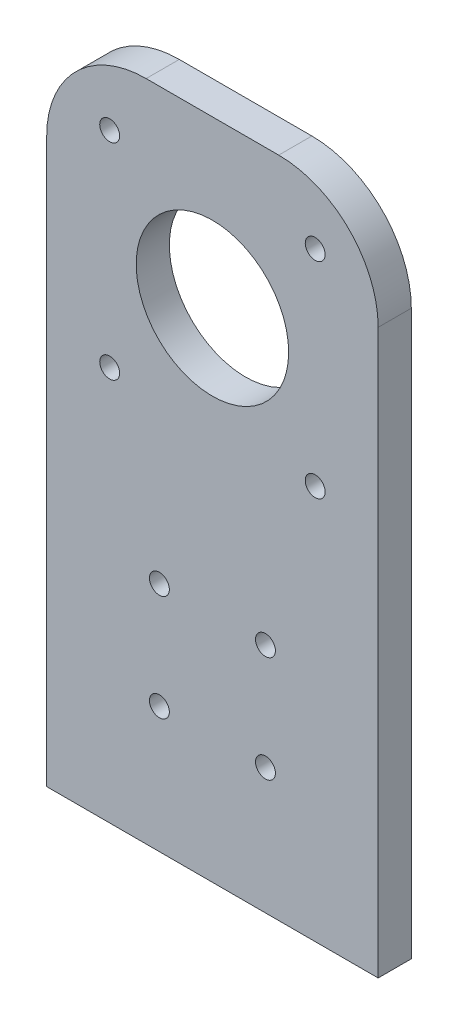
ISO-10303-21;
HEADER;
FILE_DESCRIPTION(('STEP AP214'),'2;1');
FILE_NAME('part.step','',(''),(''),'','','');
FILE_SCHEMA(('AUTOMOTIVE_DESIGN { 1 0 10303 214 1 1 1 1 }'));
ENDSEC;
DATA;
#1=APPLICATION_CONTEXT('core data for automotive mechanical design processes');
#2=APPLICATION_PROTOCOL_DEFINITION('international standard','automotive_design',2000,#1);
#3=PRODUCT_CONTEXT('',#1,'mechanical');
#4=PRODUCT('Part','Part','',(#3));
#5=PRODUCT_RELATED_PRODUCT_CATEGORY('part','',(#4));
#6=PRODUCT_DEFINITION_FORMATION('','',#4);
#7=PRODUCT_DEFINITION_CONTEXT('part definition',#1,'design');
#8=PRODUCT_DEFINITION('design','',#6,#7);
#9=PRODUCT_DEFINITION_SHAPE('','',#8);
#10=(LENGTH_UNIT() NAMED_UNIT(*) SI_UNIT(.MILLI.,.METRE.));
#11=(NAMED_UNIT(*) PLANE_ANGLE_UNIT() SI_UNIT($,.RADIAN.));
#12=(NAMED_UNIT(*) SI_UNIT($,.STERADIAN.) SOLID_ANGLE_UNIT());
#13=UNCERTAINTY_MEASURE_WITH_UNIT(LENGTH_MEASURE(1.E-05),#10,'distance_accuracy_value','');
#14=(GEOMETRIC_REPRESENTATION_CONTEXT(3) GLOBAL_UNCERTAINTY_ASSIGNED_CONTEXT((#13)) GLOBAL_UNIT_ASSIGNED_CONTEXT((#10,
#11,#12)) REPRESENTATION_CONTEXT('',''));
#15=CARTESIAN_POINT('',(0.,0.,0.));
#16=DIRECTION('',(0.,0.,1.));
#17=DIRECTION('',(1.,0.,0.));
#18=AXIS2_PLACEMENT_3D('',#15,#16,#17);
#19=CARTESIAN_POINT('',(9.91259609725116,92.0888197016812,5.));
#20=DIRECTION('',(0.,0.,-1.));
#21=DIRECTION('',(-1.,0.,0.));
#22=AXIS2_PLACEMENT_3D('',#19,#20,#21);
#23=PLANE('',#22);
#24=CARTESIAN_POINT('',(-8.08740390274895,26.0888197016812,5.));
#25=DIRECTION('',(0.,0.,-1.));
#26=DIRECTION('',(-1.,0.,0.));
#27=AXIS2_PLACEMENT_3D('',#24,#25,#26);
#28=CIRCLE('',#27,1.5);
#29=CARTESIAN_POINT('',(-9.58740390274896,26.0888197016812,5.));
#30=VERTEX_POINT('',#29);
#31=EDGE_CURVE('E204',#30,#30,#28,.T.);
#32=ORIENTED_EDGE('',*,*,#31,.T.);
#33=EDGE_LOOP('',(#32));
#34=FACE_BOUND('',#33,.T.);
#35=CARTESIAN_POINT('',(7.91259609725109,26.0888197016812,5.));
#36=DIRECTION('',(0.,0.,-1.));
#37=DIRECTION('',(-1.,0.,0.));
#38=AXIS2_PLACEMENT_3D('',#35,#36,#37);
#39=CIRCLE('',#38,1.5);
#40=CARTESIAN_POINT('',(6.41259609725109,26.0888197016812,5.));
#41=VERTEX_POINT('',#40);
#42=EDGE_CURVE('E213',#41,#41,#39,.T.);
#43=ORIENTED_EDGE('',*,*,#42,.T.);
#44=EDGE_LOOP('',(#43));
#45=FACE_BOUND('',#44,.T.);
#46=DIRECTION('',(1.,0.,0.));
#47=VECTOR('',#46,1.);
#48=CARTESIAN_POINT('',(-25.0874039027488,7.08881970168123,5.));
#49=LINE('',#48,#47);
#50=CARTESIAN_POINT('',(-25.0874039027488,7.08881970168123,5.));
#51=VERTEX_POINT('',#50);
#52=CARTESIAN_POINT('',(24.9125960972512,7.08881970168123,5.));
#53=VERTEX_POINT('',#52);
#54=EDGE_CURVE('E133',#51,#53,#49,.T.);
#55=ORIENTED_EDGE('',*,*,#54,.T.);
#56=DIRECTION('',(0.,1.,0.));
#57=VECTOR('',#56,1.);
#58=CARTESIAN_POINT('',(24.9125960972512,7.08881970168123,5.));
#59=LINE('',#58,#57);
#60=CARTESIAN_POINT('',(24.9125960972512,92.0888197016811,5.));
#61=VERTEX_POINT('',#60);
#62=EDGE_CURVE('E91',#53,#61,#59,.T.);
#63=ORIENTED_EDGE('',*,*,#62,.T.);
#64=CARTESIAN_POINT('',(9.91259609725116,92.0888197016812,5.));
#65=DIRECTION('',(0.,0.,1.));
#66=DIRECTION('',(-1.,0.,0.));
#67=AXIS2_PLACEMENT_3D('',#64,#65,#66);
#68=CIRCLE('',#67,15.);
#69=CARTESIAN_POINT('',(9.91259609725106,107.088819701681,5.));
#70=VERTEX_POINT('',#69);
#71=EDGE_CURVE('E104',#61,#70,#68,.T.);
#72=ORIENTED_EDGE('',*,*,#71,.T.);
#73=DIRECTION('',(-1.,0.,0.));
#74=VECTOR('',#73,1.);
#75=CARTESIAN_POINT('',(-10.0874039027487,107.088819701681,5.));
#76=LINE('',#75,#74);
#77=CARTESIAN_POINT('',(-10.0874039027487,107.088819701681,5.));
#78=VERTEX_POINT('',#77);
#79=EDGE_CURVE('E98',#70,#78,#76,.T.);
#80=ORIENTED_EDGE('',*,*,#79,.T.);
#81=CARTESIAN_POINT('',(-10.0874039027488,92.0888197016812,5.));
#82=DIRECTION('',(0.,0.,1.));
#83=DIRECTION('',(-1.,0.,0.));
#84=AXIS2_PLACEMENT_3D('',#81,#82,#83);
#85=CIRCLE('',#84,15.);
#86=CARTESIAN_POINT('',(-25.0874039027488,92.0888197016811,5.));
#87=VERTEX_POINT('',#86);
#88=EDGE_CURVE('E102',#78,#87,#85,.T.);
#89=ORIENTED_EDGE('',*,*,#88,.T.);
#90=DIRECTION('',(0.,-1.,0.));
#91=VECTOR('',#90,1.);
#92=CARTESIAN_POINT('',(-25.0874039027488,92.0888197016811,5.));
#93=LINE('',#92,#91);
#94=EDGE_CURVE('E54',#87,#51,#93,.T.);
#95=ORIENTED_EDGE('',*,*,#94,.T.);
#96=EDGE_LOOP('',(#55,#63,#72,#80,#89,#95));
#97=FACE_BOUND('',#96,.T.);
#98=CARTESIAN_POINT('',(-0.0874039027488199,82.0888197016812,5.));
#99=DIRECTION('',(0.,0.,1.));
#100=DIRECTION('',(1.,0.,0.));
#101=AXIS2_PLACEMENT_3D('',#98,#99,#100);
#102=CIRCLE('',#101,11.5);
#103=CARTESIAN_POINT('',(11.4125960972512,82.0888197016812,5.));
#104=VERTEX_POINT('',#103);
#105=EDGE_CURVE('E126',#104,#104,#102,.T.);
#106=ORIENTED_EDGE('',*,*,#105,.F.);
#107=EDGE_LOOP('',(#106));
#108=FACE_BOUND('',#107,.T.);
#109=CARTESIAN_POINT('',(15.4125960972512,66.5888197016812,5.));
#110=DIRECTION('',(0.,0.,1.));
#111=DIRECTION('',(1.,0.,0.));
#112=AXIS2_PLACEMENT_3D('',#109,#110,#111);
#113=CIRCLE('',#112,1.5);
#114=CARTESIAN_POINT('',(16.9125960972512,66.5888197016812,5.));
#115=VERTEX_POINT('',#114);
#116=EDGE_CURVE('E248',#115,#115,#113,.T.);
#117=ORIENTED_EDGE('',*,*,#116,.F.);
#118=EDGE_LOOP('',(#117));
#119=FACE_BOUND('',#118,.T.);
#120=CARTESIAN_POINT('',(-15.5874039027488,66.5888197016812,5.));
#121=DIRECTION('',(0.,0.,1.));
#122=DIRECTION('',(-1.,0.,0.));
#123=AXIS2_PLACEMENT_3D('',#120,#121,#122);
#124=CIRCLE('',#123,1.5);
#125=CARTESIAN_POINT('',(-17.0874039027488,66.5888197016812,5.));
#126=VERTEX_POINT('',#125);
#127=EDGE_CURVE('E242',#126,#126,#124,.T.);
#128=ORIENTED_EDGE('',*,*,#127,.F.);
#129=EDGE_LOOP('',(#128));
#130=FACE_BOUND('',#129,.T.);
#131=CARTESIAN_POINT('',(15.4125960972512,97.5888197016812,5.));
#132=DIRECTION('',(0.,0.,1.));
#133=DIRECTION('',(-1.,0.,0.));
#134=AXIS2_PLACEMENT_3D('',#131,#132,#133);
#135=CIRCLE('',#134,1.5);
#136=CARTESIAN_POINT('',(13.9125960972512,97.5888197016812,5.));
#137=VERTEX_POINT('',#136);
#138=EDGE_CURVE('E236',#137,#137,#135,.T.);
#139=ORIENTED_EDGE('',*,*,#138,.F.);
#140=EDGE_LOOP('',(#139));
#141=FACE_BOUND('',#140,.T.);
#142=CARTESIAN_POINT('',(-15.5874039027488,97.5888197016812,5.));
#143=DIRECTION('',(0.,0.,1.));
#144=DIRECTION('',(1.,0.,0.));
#145=AXIS2_PLACEMENT_3D('',#142,#143,#144);
#146=CIRCLE('',#145,1.5);
#147=CARTESIAN_POINT('',(-14.0874039027488,97.5888197016812,5.));
#148=VERTEX_POINT('',#147);
#149=EDGE_CURVE('E230',#148,#148,#146,.T.);
#150=ORIENTED_EDGE('',*,*,#149,.F.);
#151=EDGE_LOOP('',(#150));
#152=FACE_BOUND('',#151,.T.);
#153=CARTESIAN_POINT('',(-8.08740390274882,42.0888197016812,5.));
#154=DIRECTION('',(0.,0.,1.));
#155=DIRECTION('',(1.,0.,0.));
#156=AXIS2_PLACEMENT_3D('',#153,#154,#155);
#157=CIRCLE('',#156,1.5);
#158=CARTESIAN_POINT('',(-6.58740390274882,42.0888197016812,5.));
#159=VERTEX_POINT('',#158);
#160=EDGE_CURVE('E224',#159,#159,#157,.T.);
#161=ORIENTED_EDGE('',*,*,#160,.F.);
#162=EDGE_LOOP('',(#161));
#163=FACE_BOUND('',#162,.T.);
#164=CARTESIAN_POINT('',(7.91259609725118,42.0888197016812,5.));
#165=DIRECTION('',(0.,0.,1.));
#166=DIRECTION('',(-1.,0.,0.));
#167=AXIS2_PLACEMENT_3D('',#164,#165,#166);
#168=CIRCLE('',#167,1.5);
#169=CARTESIAN_POINT('',(6.41259609725118,42.0888197016812,5.));
#170=VERTEX_POINT('',#169);
#171=EDGE_CURVE('E218',#170,#170,#168,.T.);
#172=ORIENTED_EDGE('',*,*,#171,.F.);
#173=EDGE_LOOP('',(#172));
#174=FACE_BOUND('',#173,.T.);
#175=ADVANCED_FACE('F37',(#34,#45,#97,#108,#119,#130,#141,#152,#163,#174),#23,.F.);
#176=CARTESIAN_POINT('',(9.91259609725116,92.0888197016812,0.));
#177=DIRECTION('',(0.,0.,-1.));
#178=DIRECTION('',(-1.,0.,0.));
#179=AXIS2_PLACEMENT_3D('',#176,#177,#178);
#180=PLANE('',#179);
#181=CARTESIAN_POINT('',(-8.08740390274895,26.0888197016812,0.));
#182=DIRECTION('',(0.,0.,-1.));
#183=DIRECTION('',(-1.,0.,0.));
#184=AXIS2_PLACEMENT_3D('',#181,#182,#183);
#185=CIRCLE('',#184,1.5);
#186=CARTESIAN_POINT('',(-9.58740390274896,26.0888197016812,0.));
#187=VERTEX_POINT('',#186);
#188=EDGE_CURVE('E207',#187,#187,#185,.T.);
#189=ORIENTED_EDGE('',*,*,#188,.F.);
#190=EDGE_LOOP('',(#189));
#191=FACE_BOUND('',#190,.T.);
#192=CARTESIAN_POINT('',(7.91259609725109,26.0888197016812,0.));
#193=DIRECTION('',(0.,0.,-1.));
#194=DIRECTION('',(-1.,0.,0.));
#195=AXIS2_PLACEMENT_3D('',#192,#193,#194);
#196=CIRCLE('',#195,1.5);
#197=CARTESIAN_POINT('',(6.41259609725109,26.0888197016812,0.));
#198=VERTEX_POINT('',#197);
#199=EDGE_CURVE('E208',#198,#198,#196,.T.);
#200=ORIENTED_EDGE('',*,*,#199,.F.);
#201=EDGE_LOOP('',(#200));
#202=FACE_BOUND('',#201,.T.);
#203=CARTESIAN_POINT('',(-8.08740390274882,42.0888197016812,0.));
#204=DIRECTION('',(0.,0.,1.));
#205=DIRECTION('',(1.,0.,0.));
#206=AXIS2_PLACEMENT_3D('',#203,#204,#205);
#207=CIRCLE('',#206,1.5);
#208=CARTESIAN_POINT('',(-6.58740390274882,42.0888197016812,0.));
#209=VERTEX_POINT('',#208);
#210=EDGE_CURVE('E221',#209,#209,#207,.T.);
#211=ORIENTED_EDGE('',*,*,#210,.T.);
#212=EDGE_LOOP('',(#211));
#213=FACE_BOUND('',#212,.T.);
#214=CARTESIAN_POINT('',(15.4125960972512,97.5888197016812,0.));
#215=DIRECTION('',(0.,0.,1.));
#216=DIRECTION('',(-1.,0.,0.));
#217=AXIS2_PLACEMENT_3D('',#214,#215,#216);
#218=CIRCLE('',#217,1.5);
#219=CARTESIAN_POINT('',(13.9125960972512,97.5888197016812,0.));
#220=VERTEX_POINT('',#219);
#221=EDGE_CURVE('E233',#220,#220,#218,.T.);
#222=ORIENTED_EDGE('',*,*,#221,.T.);
#223=EDGE_LOOP('',(#222));
#224=FACE_BOUND('',#223,.T.);
#225=CARTESIAN_POINT('',(15.4125960972512,66.5888197016812,0.));
#226=DIRECTION('',(0.,0.,1.));
#227=DIRECTION('',(1.,0.,0.));
#228=AXIS2_PLACEMENT_3D('',#225,#226,#227);
#229=CIRCLE('',#228,1.5);
#230=CARTESIAN_POINT('',(16.9125960972512,66.5888197016812,0.));
#231=VERTEX_POINT('',#230);
#232=EDGE_CURVE('E245',#231,#231,#229,.T.);
#233=ORIENTED_EDGE('',*,*,#232,.T.);
#234=EDGE_LOOP('',(#233));
#235=FACE_BOUND('',#234,.T.);
#236=DIRECTION('',(1.,0.,0.));
#237=VECTOR('',#236,1.);
#238=CARTESIAN_POINT('',(-25.0874039027488,7.08881970168123,0.));
#239=LINE('',#238,#237);
#240=CARTESIAN_POINT('',(-25.0874039027488,7.08881970168123,0.));
#241=VERTEX_POINT('',#240);
#242=CARTESIAN_POINT('',(24.9125960972512,7.08881970168123,0.));
#243=VERTEX_POINT('',#242);
#244=EDGE_CURVE('E122',#241,#243,#239,.T.);
#245=ORIENTED_EDGE('',*,*,#244,.F.);
#246=DIRECTION('',(0.,-1.,0.));
#247=VECTOR('',#246,1.);
#248=CARTESIAN_POINT('',(-25.0874039027488,92.0888197016811,0.));
#249=LINE('',#248,#247);
#250=CARTESIAN_POINT('',(-25.0874039027488,92.0888197016811,0.));
#251=VERTEX_POINT('',#250);
#252=EDGE_CURVE('E83',#251,#241,#249,.T.);
#253=ORIENTED_EDGE('',*,*,#252,.F.);
#254=CARTESIAN_POINT('',(-10.0874039027488,92.0888197016812,0.));
#255=DIRECTION('',(0.,0.,1.));
#256=DIRECTION('',(-1.,0.,0.));
#257=AXIS2_PLACEMENT_3D('',#254,#255,#256);
#258=CIRCLE('',#257,15.);
#259=CARTESIAN_POINT('',(-10.0874039027487,107.088819701681,0.));
#260=VERTEX_POINT('',#259);
#261=EDGE_CURVE('E77',#260,#251,#258,.T.);
#262=ORIENTED_EDGE('',*,*,#261,.F.);
#263=DIRECTION('',(-1.,0.,0.));
#264=VECTOR('',#263,1.);
#265=CARTESIAN_POINT('',(-10.0874039027487,107.088819701681,0.));
#266=LINE('',#265,#264);
#267=CARTESIAN_POINT('',(9.91259609725106,107.088819701681,0.));
#268=VERTEX_POINT('',#267);
#269=EDGE_CURVE('E112',#268,#260,#266,.T.);
#270=ORIENTED_EDGE('',*,*,#269,.F.);
#271=CARTESIAN_POINT('',(9.91259609725116,92.0888197016812,0.));
#272=DIRECTION('',(0.,0.,1.));
#273=DIRECTION('',(-1.,0.,0.));
#274=AXIS2_PLACEMENT_3D('',#271,#272,#273);
#275=CIRCLE('',#274,15.);
#276=CARTESIAN_POINT('',(24.9125960972512,92.0888197016811,0.));
#277=VERTEX_POINT('',#276);
#278=EDGE_CURVE('E128',#277,#268,#275,.T.);
#279=ORIENTED_EDGE('',*,*,#278,.F.);
#280=DIRECTION('',(0.,1.,0.));
#281=VECTOR('',#280,1.);
#282=CARTESIAN_POINT('',(24.9125960972512,7.08881970168123,0.));
#283=LINE('',#282,#281);
#284=EDGE_CURVE('E125',#243,#277,#283,.T.);
#285=ORIENTED_EDGE('',*,*,#284,.F.);
#286=EDGE_LOOP('',(#245,#253,#262,#270,#279,#285));
#287=FACE_BOUND('',#286,.T.);
#288=CARTESIAN_POINT('',(-0.0874039027488199,82.0888197016812,0.));
#289=DIRECTION('',(0.,0.,1.));
#290=DIRECTION('',(1.,0.,0.));
#291=AXIS2_PLACEMENT_3D('',#288,#289,#290);
#292=CIRCLE('',#291,11.5);
#293=CARTESIAN_POINT('',(11.4125960972512,82.0888197016812,0.));
#294=VERTEX_POINT('',#293);
#295=EDGE_CURVE('E251',#294,#294,#292,.T.);
#296=ORIENTED_EDGE('',*,*,#295,.T.);
#297=EDGE_LOOP('',(#296));
#298=FACE_BOUND('',#297,.T.);
#299=CARTESIAN_POINT('',(-15.5874039027488,66.5888197016812,0.));
#300=DIRECTION('',(0.,0.,1.));
#301=DIRECTION('',(-1.,0.,0.));
#302=AXIS2_PLACEMENT_3D('',#299,#300,#301);
#303=CIRCLE('',#302,1.5);
#304=CARTESIAN_POINT('',(-17.0874039027488,66.5888197016812,0.));
#305=VERTEX_POINT('',#304);
#306=EDGE_CURVE('E239',#305,#305,#303,.T.);
#307=ORIENTED_EDGE('',*,*,#306,.T.);
#308=EDGE_LOOP('',(#307));
#309=FACE_BOUND('',#308,.T.);
#310=CARTESIAN_POINT('',(-15.5874039027488,97.5888197016812,0.));
#311=DIRECTION('',(0.,0.,1.));
#312=DIRECTION('',(1.,0.,0.));
#313=AXIS2_PLACEMENT_3D('',#310,#311,#312);
#314=CIRCLE('',#313,1.5);
#315=CARTESIAN_POINT('',(-14.0874039027488,97.5888197016812,0.));
#316=VERTEX_POINT('',#315);
#317=EDGE_CURVE('E227',#316,#316,#314,.T.);
#318=ORIENTED_EDGE('',*,*,#317,.T.);
#319=EDGE_LOOP('',(#318));
#320=FACE_BOUND('',#319,.T.);
#321=CARTESIAN_POINT('',(7.91259609725118,42.0888197016812,0.));
#322=DIRECTION('',(0.,0.,1.));
#323=DIRECTION('',(-1.,0.,0.));
#324=AXIS2_PLACEMENT_3D('',#321,#322,#323);
#325=CIRCLE('',#324,1.5);
#326=CARTESIAN_POINT('',(6.41259609725118,42.0888197016812,0.));
#327=VERTEX_POINT('',#326);
#328=EDGE_CURVE('E210',#327,#327,#325,.T.);
#329=ORIENTED_EDGE('',*,*,#328,.T.);
#330=EDGE_LOOP('',(#329));
#331=FACE_BOUND('',#330,.T.);
#332=ADVANCED_FACE('F142',(#191,#202,#213,#224,#235,#287,#298,#309,#320,#331),#180,.T.);
#333=CARTESIAN_POINT('',(-25.0874039027488,7.08881970168123,5.));
#334=DIRECTION('',(0.,1.,0.));
#335=DIRECTION('',(-1.,0.,0.));
#336=AXIS2_PLACEMENT_3D('',#333,#334,#335);
#337=PLANE('',#336);
#338=ORIENTED_EDGE('',*,*,#244,.T.);
#339=DIRECTION('',(0.,0.,-1.));
#340=VECTOR('',#339,1.);
#341=CARTESIAN_POINT('',(24.9125960972512,7.08881970168123,5.));
#342=LINE('',#341,#340);
#343=EDGE_CURVE('E11',#53,#243,#342,.T.);
#344=ORIENTED_EDGE('',*,*,#343,.F.);
#345=ORIENTED_EDGE('',*,*,#54,.F.);
#346=DIRECTION('',(0.,0.,-1.));
#347=VECTOR('',#346,1.);
#348=CARTESIAN_POINT('',(-25.0874039027488,7.08881970168123,5.));
#349=LINE('',#348,#347);
#350=EDGE_CURVE('E118',#51,#241,#349,.T.);
#351=ORIENTED_EDGE('',*,*,#350,.T.);
#352=EDGE_LOOP('',(#338,#344,#345,#351));
#353=FACE_BOUND('',#352,.T.);
#354=ADVANCED_FACE('F39',(#353),#337,.F.);
#355=CARTESIAN_POINT('',(24.9125960972512,7.08881970168123,5.));
#356=DIRECTION('',(-1.,0.,0.));
#357=DIRECTION('',(0.,0.,1.));
#358=AXIS2_PLACEMENT_3D('',#355,#356,#357);
#359=PLANE('',#358);
#360=ORIENTED_EDGE('',*,*,#284,.T.);
#361=DIRECTION('',(0.,0.,-1.));
#362=VECTOR('',#361,1.);
#363=CARTESIAN_POINT('',(24.9125960972512,92.0888197016811,5.));
#364=LINE('',#363,#362);
#365=EDGE_CURVE('E46',#61,#277,#364,.T.);
#366=ORIENTED_EDGE('',*,*,#365,.F.);
#367=ORIENTED_EDGE('',*,*,#62,.F.);
#368=ORIENTED_EDGE('',*,*,#343,.T.);
#369=EDGE_LOOP('',(#360,#366,#367,#368));
#370=FACE_BOUND('',#369,.T.);
#371=ADVANCED_FACE('F360',(#370),#359,.F.);
#372=CARTESIAN_POINT('',(9.91259609725116,92.0888197016812,5.));
#373=DIRECTION('',(0.,0.,-1.));
#374=DIRECTION('',(-1.,0.,0.));
#375=AXIS2_PLACEMENT_3D('',#372,#373,#374);
#376=CYLINDRICAL_SURFACE('',#375,15.);
#377=ORIENTED_EDGE('',*,*,#278,.T.);
#378=DIRECTION('',(0.,0.,-1.));
#379=VECTOR('',#378,1.);
#380=CARTESIAN_POINT('',(9.91259609725106,107.088819701681,5.));
#381=LINE('',#380,#379);
#382=EDGE_CURVE('E113',#70,#268,#381,.T.);
#383=ORIENTED_EDGE('',*,*,#382,.F.);
#384=ORIENTED_EDGE('',*,*,#71,.F.);
#385=ORIENTED_EDGE('',*,*,#365,.T.);
#386=EDGE_LOOP('',(#377,#383,#384,#385));
#387=FACE_BOUND('',#386,.T.);
#388=ADVANCED_FACE('F139',(#387),#376,.T.);
#389=CARTESIAN_POINT('',(-10.0874039027487,107.088819701681,5.));
#390=DIRECTION('',(0.,-1.,0.));
#391=DIRECTION('',(0.,0.,-1.));
#392=AXIS2_PLACEMENT_3D('',#389,#390,#391);
#393=PLANE('',#392);
#394=ORIENTED_EDGE('',*,*,#269,.T.);
#395=DIRECTION('',(0.,0.,-1.));
#396=VECTOR('',#395,1.);
#397=CARTESIAN_POINT('',(-10.0874039027487,107.088819701681,5.));
#398=LINE('',#397,#396);
#399=EDGE_CURVE('E109',#78,#260,#398,.T.);
#400=ORIENTED_EDGE('',*,*,#399,.F.);
#401=ORIENTED_EDGE('',*,*,#79,.F.);
#402=ORIENTED_EDGE('',*,*,#382,.T.);
#403=EDGE_LOOP('',(#394,#400,#401,#402));
#404=FACE_BOUND('',#403,.T.);
#405=ADVANCED_FACE('F110',(#404),#393,.F.);
#406=CARTESIAN_POINT('',(-10.0874039027488,92.0888197016812,5.));
#407=DIRECTION('',(0.,0.,-1.));
#408=DIRECTION('',(-1.,0.,0.));
#409=AXIS2_PLACEMENT_3D('',#406,#407,#408);
#410=CYLINDRICAL_SURFACE('',#409,15.);
#411=ORIENTED_EDGE('',*,*,#261,.T.);
#412=DIRECTION('',(0.,0.,-1.));
#413=VECTOR('',#412,1.);
#414=CARTESIAN_POINT('',(-25.0874039027488,92.0888197016811,5.));
#415=LINE('',#414,#413);
#416=EDGE_CURVE('E114',#87,#251,#415,.T.);
#417=ORIENTED_EDGE('',*,*,#416,.F.);
#418=ORIENTED_EDGE('',*,*,#88,.F.);
#419=ORIENTED_EDGE('',*,*,#399,.T.);
#420=EDGE_LOOP('',(#411,#417,#418,#419));
#421=FACE_BOUND('',#420,.T.);
#422=ADVANCED_FACE('F116',(#421),#410,.T.);
#423=CARTESIAN_POINT('',(-25.0874039027488,92.0888197016811,5.));
#424=DIRECTION('',(1.,0.,0.));
#425=DIRECTION('',(0.,1.,0.));
#426=AXIS2_PLACEMENT_3D('',#423,#424,#425);
#427=PLANE('',#426);
#428=ORIENTED_EDGE('',*,*,#252,.T.);
#429=ORIENTED_EDGE('',*,*,#350,.F.);
#430=ORIENTED_EDGE('',*,*,#94,.F.);
#431=ORIENTED_EDGE('',*,*,#416,.T.);
#432=EDGE_LOOP('',(#428,#429,#430,#431));
#433=FACE_BOUND('',#432,.T.);
#434=ADVANCED_FACE('F147',(#433),#427,.F.);
#435=CARTESIAN_POINT('',(-0.0874039027488199,82.0888197016812,5.));
#436=DIRECTION('',(0.,0.,-1.));
#437=DIRECTION('',(-1.,0.,0.));
#438=AXIS2_PLACEMENT_3D('',#435,#436,#437);
#439=CYLINDRICAL_SURFACE('',#438,11.5);
#440=ORIENTED_EDGE('',*,*,#105,.T.);
#441=EDGE_LOOP('',(#440));
#442=FACE_BOUND('',#441,.T.);
#443=ORIENTED_EDGE('',*,*,#295,.F.);
#444=EDGE_LOOP('',(#443));
#445=FACE_BOUND('',#444,.T.);
#446=ADVANCED_FACE('F149',(#442,#445),#439,.F.);
#447=CARTESIAN_POINT('',(15.4125960972512,66.5888197016812,5.));
#448=DIRECTION('',(0.,0.,-1.));
#449=DIRECTION('',(-1.,0.,0.));
#450=AXIS2_PLACEMENT_3D('',#447,#448,#449);
#451=CYLINDRICAL_SURFACE('',#450,1.5);
#452=ORIENTED_EDGE('',*,*,#116,.T.);
#453=EDGE_LOOP('',(#452));
#454=FACE_BOUND('',#453,.T.);
#455=ORIENTED_EDGE('',*,*,#232,.F.);
#456=EDGE_LOOP('',(#455));
#457=FACE_BOUND('',#456,.T.);
#458=ADVANCED_FACE('F155',(#454,#457),#451,.F.);
#459=CARTESIAN_POINT('',(-15.5874039027488,66.5888197016812,5.));
#460=DIRECTION('',(0.,0.,-1.));
#461=DIRECTION('',(-1.,0.,0.));
#462=AXIS2_PLACEMENT_3D('',#459,#460,#461);
#463=CYLINDRICAL_SURFACE('',#462,1.5);
#464=ORIENTED_EDGE('',*,*,#127,.T.);
#465=EDGE_LOOP('',(#464));
#466=FACE_BOUND('',#465,.T.);
#467=ORIENTED_EDGE('',*,*,#306,.F.);
#468=EDGE_LOOP('',(#467));
#469=FACE_BOUND('',#468,.T.);
#470=ADVANCED_FACE('F172',(#466,#469),#463,.F.);
#471=CARTESIAN_POINT('',(15.4125960972512,97.5888197016812,5.));
#472=DIRECTION('',(0.,0.,-1.));
#473=DIRECTION('',(-1.,0.,0.));
#474=AXIS2_PLACEMENT_3D('',#471,#472,#473);
#475=CYLINDRICAL_SURFACE('',#474,1.5);
#476=ORIENTED_EDGE('',*,*,#138,.T.);
#477=EDGE_LOOP('',(#476));
#478=FACE_BOUND('',#477,.T.);
#479=ORIENTED_EDGE('',*,*,#221,.F.);
#480=EDGE_LOOP('',(#479));
#481=FACE_BOUND('',#480,.T.);
#482=ADVANCED_FACE('F176',(#478,#481),#475,.F.);
#483=CARTESIAN_POINT('',(-15.5874039027488,97.5888197016812,5.));
#484=DIRECTION('',(0.,0.,-1.));
#485=DIRECTION('',(-1.,0.,0.));
#486=AXIS2_PLACEMENT_3D('',#483,#484,#485);
#487=CYLINDRICAL_SURFACE('',#486,1.5);
#488=ORIENTED_EDGE('',*,*,#149,.T.);
#489=EDGE_LOOP('',(#488));
#490=FACE_BOUND('',#489,.T.);
#491=ORIENTED_EDGE('',*,*,#317,.F.);
#492=EDGE_LOOP('',(#491));
#493=FACE_BOUND('',#492,.T.);
#494=ADVANCED_FACE('F180',(#490,#493),#487,.F.);
#495=CARTESIAN_POINT('',(-8.08740390274882,42.0888197016812,5.));
#496=DIRECTION('',(0.,0.,-1.));
#497=DIRECTION('',(-1.,0.,0.));
#498=AXIS2_PLACEMENT_3D('',#495,#496,#497);
#499=CYLINDRICAL_SURFACE('',#498,1.5);
#500=ORIENTED_EDGE('',*,*,#160,.T.);
#501=EDGE_LOOP('',(#500));
#502=FACE_BOUND('',#501,.T.);
#503=ORIENTED_EDGE('',*,*,#210,.F.);
#504=EDGE_LOOP('',(#503));
#505=FACE_BOUND('',#504,.T.);
#506=ADVANCED_FACE('F184',(#502,#505),#499,.F.);
#507=CARTESIAN_POINT('',(7.91259609725118,42.0888197016812,5.));
#508=DIRECTION('',(0.,0.,-1.));
#509=DIRECTION('',(-1.,0.,0.));
#510=AXIS2_PLACEMENT_3D('',#507,#508,#509);
#511=CYLINDRICAL_SURFACE('',#510,1.5);
#512=ORIENTED_EDGE('',*,*,#171,.T.);
#513=EDGE_LOOP('',(#512));
#514=FACE_BOUND('',#513,.T.);
#515=ORIENTED_EDGE('',*,*,#328,.F.);
#516=EDGE_LOOP('',(#515));
#517=FACE_BOUND('',#516,.T.);
#518=ADVANCED_FACE('F188',(#514,#517),#511,.F.);
#519=CARTESIAN_POINT('',(7.91259609725109,26.0888197016812,5.));
#520=DIRECTION('',(0.,0.,-1.));
#521=DIRECTION('',(-1.,0.,0.));
#522=AXIS2_PLACEMENT_3D('',#519,#520,#521);
#523=CYLINDRICAL_SURFACE('',#522,1.5);
#524=ORIENTED_EDGE('',*,*,#42,.F.);
#525=EDGE_LOOP('',(#524));
#526=FACE_BOUND('',#525,.T.);
#527=ORIENTED_EDGE('',*,*,#199,.T.);
#528=EDGE_LOOP('',(#527));
#529=FACE_BOUND('',#528,.T.);
#530=ADVANCED_FACE('F192',(#526,#529),#523,.F.);
#531=CARTESIAN_POINT('',(-8.08740390274895,26.0888197016812,5.));
#532=DIRECTION('',(0.,0.,-1.));
#533=DIRECTION('',(-1.,0.,0.));
#534=AXIS2_PLACEMENT_3D('',#531,#532,#533);
#535=CYLINDRICAL_SURFACE('',#534,1.5);
#536=ORIENTED_EDGE('',*,*,#31,.F.);
#537=EDGE_LOOP('',(#536));
#538=FACE_BOUND('',#537,.T.);
#539=ORIENTED_EDGE('',*,*,#188,.T.);
#540=EDGE_LOOP('',(#539));
#541=FACE_BOUND('',#540,.T.);
#542=ADVANCED_FACE('F196',(#538,#541),#535,.F.);
#543=CLOSED_SHELL('',(#175,#332,#354,#371,#388,#405,#422,#434,#446,#458,#470,#482,#494,#506,
#518,#530,#542));
#544=MANIFOLD_SOLID_BREP('B2',#543);
#545=ADVANCED_BREP_SHAPE_REPRESENTATION('',(#18,#544),#14);
#546=SHAPE_DEFINITION_REPRESENTATION(#9,#545);
ENDSEC;
END-ISO-10303-21;
